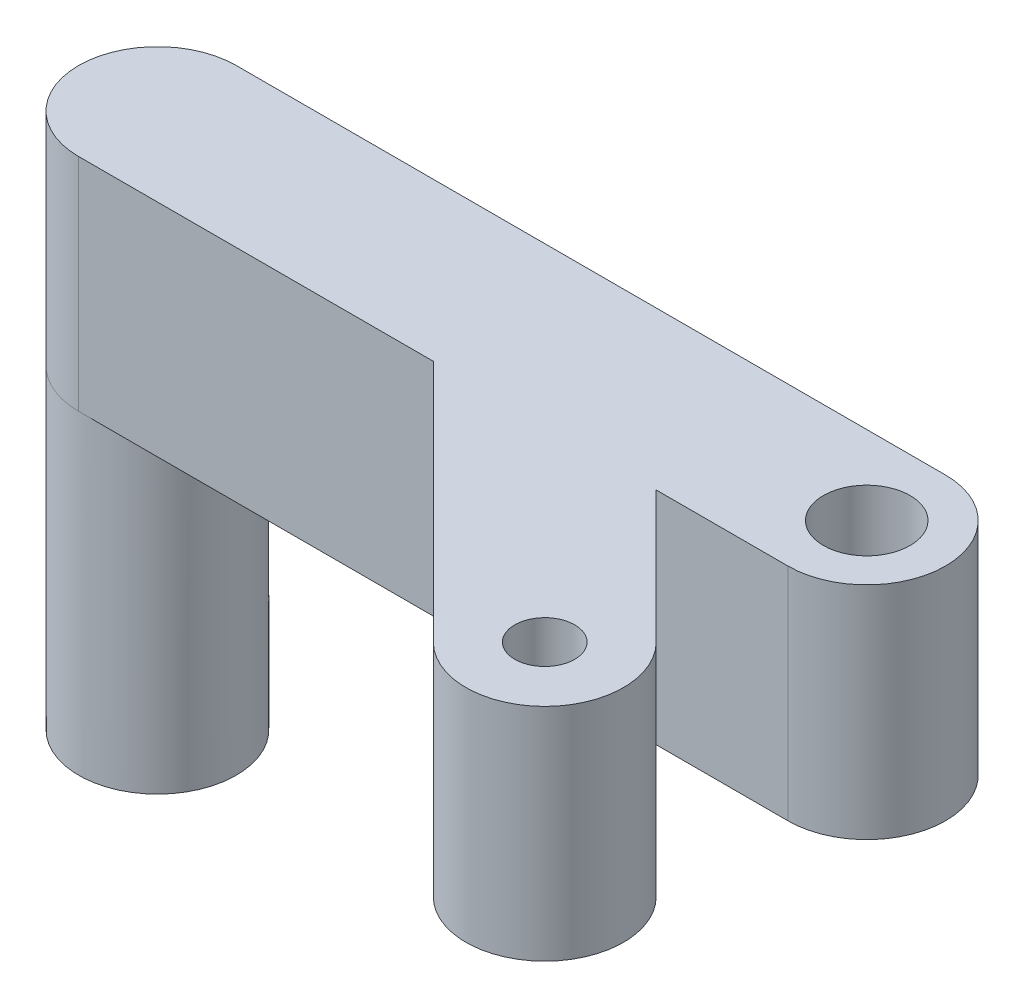
ISO-10303-21;
HEADER;
FILE_DESCRIPTION(('STEP AP214'),'2;1');
FILE_NAME('part.step','',(''),(''),'','','');
FILE_SCHEMA(('AUTOMOTIVE_DESIGN { 1 0 10303 214 1 1 1 1 }'));
ENDSEC;
DATA;
#1=APPLICATION_CONTEXT('core data for automotive mechanical design processes');
#2=APPLICATION_PROTOCOL_DEFINITION('international standard','automotive_design',2000,#1);
#3=PRODUCT_CONTEXT('',#1,'mechanical');
#4=PRODUCT('Part','Part','',(#3));
#5=PRODUCT_RELATED_PRODUCT_CATEGORY('part','',(#4));
#6=PRODUCT_DEFINITION_FORMATION('','',#4);
#7=PRODUCT_DEFINITION_CONTEXT('part definition',#1,'design');
#8=PRODUCT_DEFINITION('design','',#6,#7);
#9=PRODUCT_DEFINITION_SHAPE('','',#8);
#10=(LENGTH_UNIT() NAMED_UNIT(*) SI_UNIT(.MILLI.,.METRE.));
#11=(NAMED_UNIT(*) PLANE_ANGLE_UNIT() SI_UNIT($,.RADIAN.));
#12=(NAMED_UNIT(*) SI_UNIT($,.STERADIAN.) SOLID_ANGLE_UNIT());
#13=UNCERTAINTY_MEASURE_WITH_UNIT(LENGTH_MEASURE(1.E-05),#10,'distance_accuracy_value','');
#14=(GEOMETRIC_REPRESENTATION_CONTEXT(3) GLOBAL_UNCERTAINTY_ASSIGNED_CONTEXT((#13)) GLOBAL_UNIT_ASSIGNED_CONTEXT((#10,
#11,#12)) REPRESENTATION_CONTEXT('',''));
#15=CARTESIAN_POINT('',(0.,0.,0.));
#16=DIRECTION('',(0.,0.,1.));
#17=DIRECTION('',(1.,0.,0.));
#18=AXIS2_PLACEMENT_3D('',#15,#16,#17);
#19=CARTESIAN_POINT('',(-50.,-50.9901951359279,5.));
#20=DIRECTION('',(0.,0.,1.));
#21=DIRECTION('',(1.,0.,0.));
#22=AXIS2_PLACEMENT_3D('',#19,#20,#21);
#23=PLANE('',#22);
#24=DIRECTION('',(0.,1.,0.));
#25=VECTOR('',#24,1.);
#26=CARTESIAN_POINT('',(-8.35786437626907,-29.3203434614058,5.));
#27=LINE('',#26,#25);
#28=CARTESIAN_POINT('',(-8.35786437626907,0.,5.));
#29=VERTEX_POINT('',#28);
#30=CARTESIAN_POINT('',(-8.35786437626907,14.,5.));
#31=VERTEX_POINT('',#30);
#32=EDGE_CURVE('E201',#29,#31,#27,.T.);
#33=ORIENTED_EDGE('',*,*,#32,.F.);
#34=DIRECTION('',(-1.,0.,0.));
#35=VECTOR('',#34,1.);
#36=CARTESIAN_POINT('',(-50.,0.,5.));
#37=LINE('',#36,#35);
#38=CARTESIAN_POINT('',(0.,0.,5.));
#39=VERTEX_POINT('',#38);
#40=EDGE_CURVE('E143',#39,#29,#37,.T.);
#41=ORIENTED_EDGE('',*,*,#40,.F.);
#42=DIRECTION('',(0.,1.,0.));
#43=VECTOR('',#42,1.);
#44=CARTESIAN_POINT('',(0.,-50.9901951359279,5.));
#45=LINE('',#44,#43);
#46=CARTESIAN_POINT('',(0.,14.,5.));
#47=VERTEX_POINT('',#46);
#48=EDGE_CURVE('E132',#39,#47,#45,.T.);
#49=ORIENTED_EDGE('',*,*,#48,.T.);
#50=DIRECTION('',(1.,0.,0.));
#51=VECTOR('',#50,1.);
#52=CARTESIAN_POINT('',(-50.,14.,5.));
#53=LINE('',#52,#51);
#54=EDGE_CURVE('E130',#31,#47,#53,.T.);
#55=ORIENTED_EDGE('',*,*,#54,.F.);
#56=EDGE_LOOP('',(#33,#41,#49,#55));
#57=FACE_BOUND('',#56,.T.);
#58=ADVANCED_FACE('F37',(#57),#23,.T.);
#59=CARTESIAN_POINT('',(0.,0.,0.));
#60=DIRECTION('',(0.,1.,0.));
#61=DIRECTION('',(0.,0.,1.));
#62=AXIS2_PLACEMENT_3D('',#59,#60,#61);
#63=PLANE('',#62);
#64=CARTESIAN_POINT('',(-3.53553390593274,0.,16.8933982822018));
#65=DIRECTION('',(0.,1.,0.));
#66=DIRECTION('',(0.,0.,1.));
#67=AXIS2_PLACEMENT_3D('',#64,#65,#66);
#68=CIRCLE('',#67,1.9);
#69=CARTESIAN_POINT('',(-3.53553390593274,0.,18.7933982822018));
#70=VERTEX_POINT('',#69);
#71=EDGE_CURVE('E116',#70,#70,#68,.T.);
#72=ORIENTED_EDGE('',*,*,#71,.T.);
#73=EDGE_LOOP('',(#72));
#74=FACE_BOUND('',#73,.T.);
#75=CARTESIAN_POINT('',(-45.,0.,0.));
#76=DIRECTION('',(0.,-1.,0.));
#77=DIRECTION('',(0.,0.,-1.));
#78=AXIS2_PLACEMENT_3D('',#75,#76,#77);
#79=CIRCLE('',#78,5.);
#80=CARTESIAN_POINT('',(-45.,0.,-5.));
#81=VERTEX_POINT('',#80);
#82=CARTESIAN_POINT('',(-45.,0.,5.));
#83=VERTEX_POINT('',#82);
#84=EDGE_CURVE('E171',#81,#83,#79,.T.);
#85=ORIENTED_EDGE('',*,*,#84,.F.);
#86=DIRECTION('',(1.,0.,0.));
#87=VECTOR('',#86,1.);
#88=CARTESIAN_POINT('',(0.,0.,-5.));
#89=LINE('',#88,#87);
#90=CARTESIAN_POINT('',(0.,0.,-5.));
#91=VERTEX_POINT('',#90);
#92=EDGE_CURVE('E140',#81,#91,#89,.T.);
#93=ORIENTED_EDGE('',*,*,#92,.T.);
#94=CARTESIAN_POINT('',(0.,0.,0.));
#95=DIRECTION('',(0.,1.,0.));
#96=DIRECTION('',(0.,0.,1.));
#97=AXIS2_PLACEMENT_3D('',#94,#95,#96);
#98=CIRCLE('',#97,5.);
#99=EDGE_CURVE('E147',#39,#91,#98,.T.);
#100=ORIENTED_EDGE('',*,*,#99,.F.);
#101=ORIENTED_EDGE('',*,*,#40,.T.);
#102=DIRECTION('',(0.707106781186546,0.,0.707106781186549));
#103=VECTOR('',#102,1.);
#104=CARTESIAN_POINT('',(-8.35786437626907,0.,5.));
#105=LINE('',#104,#103);
#106=CARTESIAN_POINT('',(0.,0.,13.3578643762691));
#107=VERTEX_POINT('',#106);
#108=EDGE_CURVE('E176',#29,#107,#105,.T.);
#109=ORIENTED_EDGE('',*,*,#108,.T.);
#110=CARTESIAN_POINT('',(-3.53553390593274,0.,16.8933982822018));
#111=DIRECTION('',(0.,1.,0.));
#112=DIRECTION('',(0.,0.,1.));
#113=AXIS2_PLACEMENT_3D('',#110,#111,#112);
#114=CIRCLE('',#113,5.);
#115=CARTESIAN_POINT('',(-7.07106781186548,0.,20.4289321881346));
#116=VERTEX_POINT('',#115);
#117=EDGE_CURVE('E179',#107,#116,#114,.F.);
#118=ORIENTED_EDGE('',*,*,#117,.T.);
#119=DIRECTION('',(-0.707106781186547,0.,-0.707106781186549));
#120=VECTOR('',#119,1.);
#121=CARTESIAN_POINT('',(-7.07106781186548,0.,20.4289321881346));
#122=LINE('',#121,#120);
#123=CARTESIAN_POINT('',(-22.5,0.,5.));
#124=VERTEX_POINT('',#123);
#125=EDGE_CURVE('E172',#116,#124,#122,.T.);
#126=ORIENTED_EDGE('',*,*,#125,.T.);
#127=EDGE_CURVE('E123',#124,#83,#37,.T.);
#128=ORIENTED_EDGE('',*,*,#127,.T.);
#129=EDGE_LOOP('',(#85,#93,#100,#101,#109,#118,#126,#128));
#130=FACE_BOUND('',#129,.T.);
#131=CARTESIAN_POINT('',(0.,0.,0.));
#132=DIRECTION('',(0.,1.,0.));
#133=DIRECTION('',(0.,0.,1.));
#134=AXIS2_PLACEMENT_3D('',#131,#132,#133);
#135=CIRCLE('',#134,2.75);
#136=CARTESIAN_POINT('',(0.,0.,2.75));
#137=VERTEX_POINT('',#136);
#138=EDGE_CURVE('E142',#137,#137,#135,.T.);
#139=ORIENTED_EDGE('',*,*,#138,.T.);
#140=EDGE_LOOP('',(#139));
#141=FACE_BOUND('',#140,.T.);
#142=ADVANCED_FACE('F187',(#74,#130,#141),#63,.F.);
#143=CARTESIAN_POINT('',(0.,14.,0.));
#144=DIRECTION('',(0.,1.,0.));
#145=DIRECTION('',(0.,0.,1.));
#146=AXIS2_PLACEMENT_3D('',#143,#144,#145);
#147=PLANE('',#146);
#148=CARTESIAN_POINT('',(-3.53553390593274,14.,16.8933982822018));
#149=DIRECTION('',(0.,1.,0.));
#150=DIRECTION('',(0.,0.,1.));
#151=AXIS2_PLACEMENT_3D('',#148,#149,#150);
#152=CIRCLE('',#151,1.9);
#153=CARTESIAN_POINT('',(-3.53553390593274,14.,18.7933982822018));
#154=VERTEX_POINT('',#153);
#155=EDGE_CURVE('E214',#154,#154,#152,.T.);
#156=ORIENTED_EDGE('',*,*,#155,.F.);
#157=EDGE_LOOP('',(#156));
#158=FACE_BOUND('',#157,.T.);
#159=DIRECTION('',(-1.,0.,0.));
#160=VECTOR('',#159,1.);
#161=CARTESIAN_POINT('',(0.,14.,-5.));
#162=LINE('',#161,#160);
#163=CARTESIAN_POINT('',(0.,14.,-5.));
#164=VERTEX_POINT('',#163);
#165=CARTESIAN_POINT('',(-45.,14.,-4.99999999999999));
#166=VERTEX_POINT('',#165);
#167=EDGE_CURVE('E134',#164,#166,#162,.T.);
#168=ORIENTED_EDGE('',*,*,#167,.T.);
#169=CARTESIAN_POINT('',(-45.,14.,0.));
#170=DIRECTION('',(0.,1.,0.));
#171=DIRECTION('',(0.,0.,1.));
#172=AXIS2_PLACEMENT_3D('',#169,#170,#171);
#173=CIRCLE('',#172,5.);
#174=CARTESIAN_POINT('',(-50.,14.,0.));
#175=VERTEX_POINT('',#174);
#176=EDGE_CURVE('E46',#166,#175,#173,.T.);
#177=ORIENTED_EDGE('',*,*,#176,.T.);
#178=CARTESIAN_POINT('',(-45.,14.,0.));
#179=DIRECTION('',(0.,1.,0.));
#180=DIRECTION('',(0.,0.,1.));
#181=AXIS2_PLACEMENT_3D('',#178,#179,#180);
#182=CIRCLE('',#181,5.);
#183=CARTESIAN_POINT('',(-45.,14.,5.));
#184=VERTEX_POINT('',#183);
#185=EDGE_CURVE('E61',#175,#184,#182,.T.);
#186=ORIENTED_EDGE('',*,*,#185,.T.);
#187=CARTESIAN_POINT('',(-22.5,14.,5.));
#188=VERTEX_POINT('',#187);
#189=EDGE_CURVE('E121',#184,#188,#53,.T.);
#190=ORIENTED_EDGE('',*,*,#189,.T.);
#191=DIRECTION('',(0.707106781186547,0.,0.707106781186548));
#192=VECTOR('',#191,1.);
#193=CARTESIAN_POINT('',(-7.07106781186548,14.,20.4289321881346));
#194=LINE('',#193,#192);
#195=CARTESIAN_POINT('',(-7.07106781186548,14.,20.4289321881346));
#196=VERTEX_POINT('',#195);
#197=EDGE_CURVE('E109',#188,#196,#194,.T.);
#198=ORIENTED_EDGE('',*,*,#197,.T.);
#199=CARTESIAN_POINT('',(-3.53553390593274,14.,16.8933982822018));
#200=DIRECTION('',(0.,1.,0.));
#201=DIRECTION('',(0.,0.,1.));
#202=AXIS2_PLACEMENT_3D('',#199,#200,#201);
#203=CIRCLE('',#202,5.);
#204=CARTESIAN_POINT('',(0.,14.,13.3578643762691));
#205=VERTEX_POINT('',#204);
#206=EDGE_CURVE('E115',#196,#205,#203,.T.);
#207=ORIENTED_EDGE('',*,*,#206,.T.);
#208=DIRECTION('',(-0.707106781186546,0.,-0.707106781186549));
#209=VECTOR('',#208,1.);
#210=CARTESIAN_POINT('',(-8.35786437626907,14.,5.));
#211=LINE('',#210,#209);
#212=EDGE_CURVE('E124',#205,#31,#211,.T.);
#213=ORIENTED_EDGE('',*,*,#212,.T.);
#214=ORIENTED_EDGE('',*,*,#54,.T.);
#215=CARTESIAN_POINT('',(0.,14.,0.));
#216=DIRECTION('',(0.,1.,0.));
#217=DIRECTION('',(0.,0.,1.));
#218=AXIS2_PLACEMENT_3D('',#215,#216,#217);
#219=CIRCLE('',#218,5.);
#220=EDGE_CURVE('E150',#47,#164,#219,.T.);
#221=ORIENTED_EDGE('',*,*,#220,.T.);
#222=EDGE_LOOP('',(#168,#177,#186,#190,#198,#207,#213,#214,#221));
#223=FACE_BOUND('',#222,.T.);
#224=CARTESIAN_POINT('',(0.,14.,0.));
#225=DIRECTION('',(0.,1.,0.));
#226=DIRECTION('',(0.,0.,1.));
#227=AXIS2_PLACEMENT_3D('',#224,#225,#226);
#228=CIRCLE('',#227,2.75);
#229=CARTESIAN_POINT('',(0.,14.,2.75));
#230=VERTEX_POINT('',#229);
#231=EDGE_CURVE('E144',#230,#230,#228,.T.);
#232=ORIENTED_EDGE('',*,*,#231,.F.);
#233=EDGE_LOOP('',(#232));
#234=FACE_BOUND('',#233,.T.);
#235=ADVANCED_FACE('F127',(#158,#223,#234),#147,.T.);
#236=CARTESIAN_POINT('',(0.,14.,0.));
#237=DIRECTION('',(0.,-1.,0.));
#238=DIRECTION('',(0.,0.,-1.));
#239=AXIS2_PLACEMENT_3D('',#236,#237,#238);
#240=CYLINDRICAL_SURFACE('',#239,5.);
#241=ORIENTED_EDGE('',*,*,#220,.F.);
#242=ORIENTED_EDGE('',*,*,#48,.F.);
#243=ORIENTED_EDGE('',*,*,#99,.T.);
#244=DIRECTION('',(0.,1.,0.));
#245=VECTOR('',#244,1.);
#246=CARTESIAN_POINT('',(0.,-50.9901951359279,-5.));
#247=LINE('',#246,#245);
#248=EDGE_CURVE('E129',#91,#164,#247,.T.);
#249=ORIENTED_EDGE('',*,*,#248,.T.);
#250=EDGE_LOOP('',(#241,#242,#243,#249));
#251=FACE_BOUND('',#250,.T.);
#252=ADVANCED_FACE('F197',(#251),#240,.T.);
#253=CARTESIAN_POINT('',(0.,14.,0.));
#254=DIRECTION('',(0.,-1.,0.));
#255=DIRECTION('',(0.,0.,-1.));
#256=AXIS2_PLACEMENT_3D('',#253,#254,#255);
#257=CYLINDRICAL_SURFACE('',#256,2.75);
#258=ORIENTED_EDGE('',*,*,#231,.T.);
#259=EDGE_LOOP('',(#258));
#260=FACE_BOUND('',#259,.T.);
#261=ORIENTED_EDGE('',*,*,#138,.F.);
#262=EDGE_LOOP('',(#261));
#263=FACE_BOUND('',#262,.T.);
#264=ADVANCED_FACE('F227',(#260,#263),#257,.F.);
#265=DIRECTION('',(0.,1.,0.));
#266=VECTOR('',#265,1.);
#267=CARTESIAN_POINT('',(-22.5,-29.3203434614058,5.));
#268=LINE('',#267,#266);
#269=EDGE_CURVE('E53',#124,#188,#268,.T.);
#270=ORIENTED_EDGE('',*,*,#269,.T.);
#271=ORIENTED_EDGE('',*,*,#189,.F.);
#272=DIRECTION('',(0.,1.,0.));
#273=VECTOR('',#272,1.);
#274=CARTESIAN_POINT('',(-45.,-50.9901951359279,5.));
#275=LINE('',#274,#273);
#276=EDGE_CURVE('E11',#184,#83,#275,.F.);
#277=ORIENTED_EDGE('',*,*,#276,.T.);
#278=ORIENTED_EDGE('',*,*,#127,.F.);
#279=EDGE_LOOP('',(#270,#271,#277,#278));
#280=FACE_BOUND('',#279,.T.);
#281=ADVANCED_FACE('F120',(#280),#23,.T.);
#282=CARTESIAN_POINT('',(0.,-50.9901951359279,-5.));
#283=DIRECTION('',(0.,0.,-1.));
#284=DIRECTION('',(-1.,0.,0.));
#285=AXIS2_PLACEMENT_3D('',#282,#283,#284);
#286=PLANE('',#285);
#287=ORIENTED_EDGE('',*,*,#92,.F.);
#288=DIRECTION('',(0.,1.,0.));
#289=VECTOR('',#288,1.);
#290=CARTESIAN_POINT('',(-45.,-50.9901951359279,-4.99999999999999));
#291=LINE('',#290,#289);
#292=EDGE_CURVE('E156',#81,#166,#291,.T.);
#293=ORIENTED_EDGE('',*,*,#292,.T.);
#294=ORIENTED_EDGE('',*,*,#167,.F.);
#295=ORIENTED_EDGE('',*,*,#248,.F.);
#296=EDGE_LOOP('',(#287,#293,#294,#295));
#297=FACE_BOUND('',#296,.T.);
#298=ADVANCED_FACE('F192',(#297),#286,.T.);
#299=CARTESIAN_POINT('',(-45.,-20.,0.));
#300=DIRECTION('',(0.,1.,0.));
#301=DIRECTION('',(0.,0.,1.));
#302=AXIS2_PLACEMENT_3D('',#299,#300,#301);
#303=CYLINDRICAL_SURFACE('',#302,5.);
#304=CARTESIAN_POINT('',(-45.,-20.,0.));
#305=DIRECTION('',(0.,-1.,0.));
#306=DIRECTION('',(0.,0.,-1.));
#307=AXIS2_PLACEMENT_3D('',#304,#305,#306);
#308=CIRCLE('',#307,5.);
#309=CARTESIAN_POINT('',(-45.,-20.,-5.));
#310=VERTEX_POINT('',#309);
#311=EDGE_CURVE('E174',#310,#310,#308,.T.);
#312=ORIENTED_EDGE('',*,*,#311,.F.);
#313=EDGE_LOOP('',(#312));
#314=FACE_BOUND('',#313,.T.);
#315=ORIENTED_EDGE('',*,*,#84,.T.);
#316=CARTESIAN_POINT('',(-50.,0.,0.));
#317=VERTEX_POINT('',#316);
#318=EDGE_CURVE('E159',#83,#317,#79,.T.);
#319=ORIENTED_EDGE('',*,*,#318,.T.);
#320=EDGE_CURVE('E153',#317,#81,#79,.T.);
#321=ORIENTED_EDGE('',*,*,#320,.T.);
#322=EDGE_LOOP('',(#315,#319,#321));
#323=FACE_BOUND('',#322,.T.);
#324=ADVANCED_FACE('F190',(#314,#323),#303,.T.);
#325=CARTESIAN_POINT('',(-45.,-20.,0.));
#326=DIRECTION('',(0.,-1.,0.));
#327=DIRECTION('',(0.,0.,-1.));
#328=AXIS2_PLACEMENT_3D('',#325,#326,#327);
#329=PLANE('',#328);
#330=ORIENTED_EDGE('',*,*,#311,.T.);
#331=EDGE_LOOP('',(#330));
#332=FACE_BOUND('',#331,.T.);
#333=ADVANCED_FACE('F260',(#332),#329,.T.);
#334=CARTESIAN_POINT('',(-45.,-50.9901951359279,0.));
#335=DIRECTION('',(0.,1.,0.));
#336=DIRECTION('',(0.,0.,1.));
#337=AXIS2_PLACEMENT_3D('',#334,#335,#336);
#338=CYLINDRICAL_SURFACE('',#337,5.);
#339=DIRECTION('',(0.,1.,0.));
#340=VECTOR('',#339,1.);
#341=CARTESIAN_POINT('',(-50.,-50.9901951359279,0.));
#342=LINE('',#341,#340);
#343=EDGE_CURVE('E41',#317,#175,#342,.T.);
#344=ORIENTED_EDGE('',*,*,#343,.F.);
#345=ORIENTED_EDGE('',*,*,#318,.F.);
#346=ORIENTED_EDGE('',*,*,#276,.F.);
#347=ORIENTED_EDGE('',*,*,#185,.F.);
#348=EDGE_LOOP('',(#344,#345,#346,#347));
#349=FACE_BOUND('',#348,.T.);
#350=ADVANCED_FACE('F39',(#349),#338,.T.);
#351=CARTESIAN_POINT('',(-45.,-50.9901951359279,0.));
#352=DIRECTION('',(0.,1.,0.));
#353=DIRECTION('',(0.,0.,1.));
#354=AXIS2_PLACEMENT_3D('',#351,#352,#353);
#355=CYLINDRICAL_SURFACE('',#354,5.);
#356=ORIENTED_EDGE('',*,*,#320,.F.);
#357=ORIENTED_EDGE('',*,*,#343,.T.);
#358=ORIENTED_EDGE('',*,*,#176,.F.);
#359=ORIENTED_EDGE('',*,*,#292,.F.);
#360=EDGE_LOOP('',(#356,#357,#358,#359));
#361=FACE_BOUND('',#360,.T.);
#362=ADVANCED_FACE('F169',(#361),#355,.T.);
#363=CARTESIAN_POINT('',(-8.35786437626907,-29.3203434614058,5.));
#364=DIRECTION('',(0.707106781186549,0.,-0.707106781186546));
#365=DIRECTION('',(-0.707106781186546,0.,-0.707106781186549));
#366=AXIS2_PLACEMENT_3D('',#363,#364,#365);
#367=PLANE('',#366);
#368=ORIENTED_EDGE('',*,*,#108,.F.);
#369=ORIENTED_EDGE('',*,*,#32,.T.);
#370=ORIENTED_EDGE('',*,*,#212,.F.);
#371=DIRECTION('',(0.,1.,0.));
#372=VECTOR('',#371,1.);
#373=CARTESIAN_POINT('',(0.,-29.3203434614058,13.3578643762691));
#374=LINE('',#373,#372);
#375=EDGE_CURVE('E205',#107,#205,#374,.T.);
#376=ORIENTED_EDGE('',*,*,#375,.F.);
#377=EDGE_LOOP('',(#368,#369,#370,#376));
#378=FACE_BOUND('',#377,.T.);
#379=ADVANCED_FACE('F301',(#378),#367,.T.);
#380=CARTESIAN_POINT('',(-3.53553390593274,-29.3203434614058,16.8933982822018));
#381=DIRECTION('',(0.,1.,0.));
#382=DIRECTION('',(0.,0.,1.));
#383=AXIS2_PLACEMENT_3D('',#380,#381,#382);
#384=CYLINDRICAL_SURFACE('',#383,5.);
#385=ORIENTED_EDGE('',*,*,#117,.F.);
#386=ORIENTED_EDGE('',*,*,#375,.T.);
#387=ORIENTED_EDGE('',*,*,#206,.F.);
#388=DIRECTION('',(0.,1.,0.));
#389=VECTOR('',#388,1.);
#390=CARTESIAN_POINT('',(-7.07106781186548,-29.3203434614058,20.4289321881346));
#391=LINE('',#390,#389);
#392=EDGE_CURVE('E112',#116,#196,#391,.T.);
#393=ORIENTED_EDGE('',*,*,#392,.F.);
#394=EDGE_LOOP('',(#385,#386,#387,#393));
#395=FACE_BOUND('',#394,.T.);
#396=ADVANCED_FACE('F321',(#395),#384,.T.);
#397=CARTESIAN_POINT('',(-7.07106781186548,-29.3203434614058,20.4289321881346));
#398=DIRECTION('',(-0.707106781186548,0.,0.707106781186546));
#399=DIRECTION('',(0.707106781186547,0.,0.707106781186549));
#400=AXIS2_PLACEMENT_3D('',#397,#398,#399);
#401=PLANE('',#400);
#402=ORIENTED_EDGE('',*,*,#125,.F.);
#403=ORIENTED_EDGE('',*,*,#392,.T.);
#404=ORIENTED_EDGE('',*,*,#197,.F.);
#405=ORIENTED_EDGE('',*,*,#269,.F.);
#406=EDGE_LOOP('',(#402,#403,#404,#405));
#407=FACE_BOUND('',#406,.T.);
#408=ADVANCED_FACE('F110',(#407),#401,.T.);
#409=CARTESIAN_POINT('',(-3.53553390593274,-20.,16.8933982822018));
#410=DIRECTION('',(0.,1.,0.));
#411=DIRECTION('',(0.,0.,1.));
#412=AXIS2_PLACEMENT_3D('',#409,#410,#411);
#413=CYLINDRICAL_SURFACE('',#412,1.9);
#414=ORIENTED_EDGE('',*,*,#155,.T.);
#415=EDGE_LOOP('',(#414));
#416=FACE_BOUND('',#415,.T.);
#417=ORIENTED_EDGE('',*,*,#71,.F.);
#418=EDGE_LOOP('',(#417));
#419=FACE_BOUND('',#418,.T.);
#420=ADVANCED_FACE('F218',(#416,#419),#413,.F.);
#421=CLOSED_SHELL('',(#58,#142,#235,#252,#264,#281,#298,#324,#333,#350,#362,#379,#396,#408,#420));
#422=MANIFOLD_SOLID_BREP('B2',#421);
#423=ADVANCED_BREP_SHAPE_REPRESENTATION('',(#18,#422),#14);
#424=SHAPE_DEFINITION_REPRESENTATION(#9,#423);
ENDSEC;
END-ISO-10303-21;
